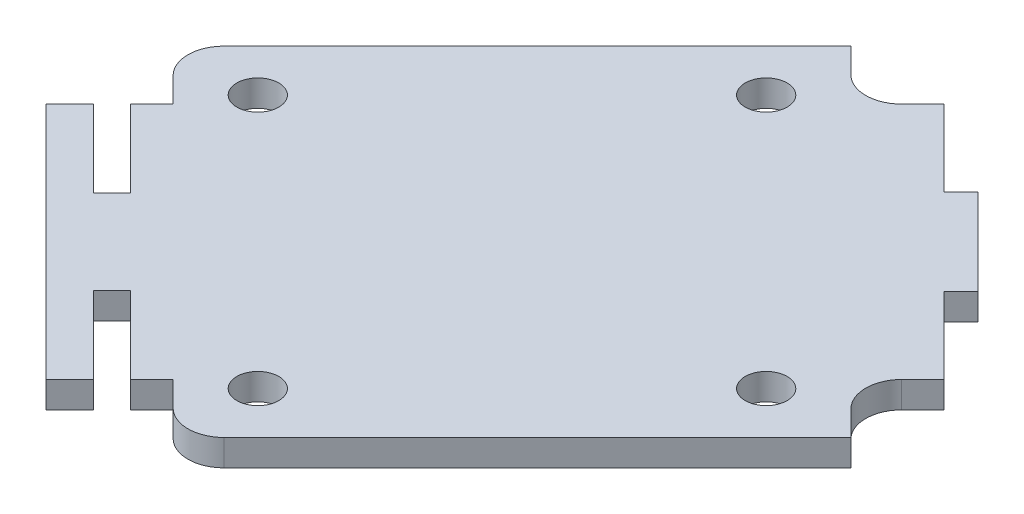
ISO-10303-21;
HEADER;
FILE_DESCRIPTION(('STEP AP214'),'2;1');
FILE_NAME('part.step','',(''),(''),'','','');
FILE_SCHEMA(('AUTOMOTIVE_DESIGN { 1 0 10303 214 1 1 1 1 }'));
ENDSEC;
DATA;
#1=APPLICATION_CONTEXT('core data for automotive mechanical design processes');
#2=APPLICATION_PROTOCOL_DEFINITION('international standard','automotive_design',2000,#1);
#3=PRODUCT_CONTEXT('',#1,'mechanical');
#4=PRODUCT('Part','Part','',(#3));
#5=PRODUCT_RELATED_PRODUCT_CATEGORY('part','',(#4));
#6=PRODUCT_DEFINITION_FORMATION('','',#4);
#7=PRODUCT_DEFINITION_CONTEXT('part definition',#1,'design');
#8=PRODUCT_DEFINITION('design','',#6,#7);
#9=PRODUCT_DEFINITION_SHAPE('','',#8);
#10=(LENGTH_UNIT() NAMED_UNIT(*) SI_UNIT(.MILLI.,.METRE.));
#11=(NAMED_UNIT(*) PLANE_ANGLE_UNIT() SI_UNIT($,.RADIAN.));
#12=(NAMED_UNIT(*) SI_UNIT($,.STERADIAN.) SOLID_ANGLE_UNIT());
#13=UNCERTAINTY_MEASURE_WITH_UNIT(LENGTH_MEASURE(1.E-05),#10,'distance_accuracy_value','');
#14=(GEOMETRIC_REPRESENTATION_CONTEXT(3) GLOBAL_UNCERTAINTY_ASSIGNED_CONTEXT((#13)) GLOBAL_UNIT_ASSIGNED_CONTEXT((#10,
#11,#12)) REPRESENTATION_CONTEXT('',''));
#15=CARTESIAN_POINT('',(0.,0.,0.));
#16=DIRECTION('',(0.,0.,1.));
#17=DIRECTION('',(1.,0.,0.));
#18=AXIS2_PLACEMENT_3D('',#15,#16,#17);
#19=CARTESIAN_POINT('',(8.81909346221887,2.2,8.81909346221887));
#20=DIRECTION('',(0.707106781186548,0.,0.707106781186548));
#21=DIRECTION('',(0.707106781186548,0.,-0.707106781186548));
#22=AXIS2_PLACEMENT_3D('',#19,#20,#21);
#23=PLANE('',#22);
#24=DIRECTION('',(-0.707106781186548,0.,0.707106781186548));
#25=VECTOR('',#24,1.);
#26=CARTESIAN_POINT('',(8.81909346221887,0.,8.81909346221887));
#27=LINE('',#26,#25);
#28=CARTESIAN_POINT('',(-32.4524908137447,0.,50.0906777381824));
#29=VERTEX_POINT('',#28);
#30=CARTESIAN_POINT('',(-58.615441717647,0.,76.2536286420847));
#31=VERTEX_POINT('',#30);
#32=EDGE_CURVE('E267',#29,#31,#27,.T.);
#33=ORIENTED_EDGE('',*,*,#32,.T.);
#34=DIRECTION('',(0.,-1.,0.));
#35=VECTOR('',#34,1.);
#36=CARTESIAN_POINT('',(-58.615441717647,2.2,76.2536286420847));
#37=LINE('',#36,#35);
#38=CARTESIAN_POINT('',(-58.615441717647,2.2,76.2536286420847));
#39=VERTEX_POINT('',#38);
#40=EDGE_CURVE('E11',#39,#31,#37,.T.);
#41=ORIENTED_EDGE('',*,*,#40,.F.);
#42=DIRECTION('',(-0.707106781186548,0.,0.707106781186548));
#43=VECTOR('',#42,1.);
#44=CARTESIAN_POINT('',(8.81909346221887,2.2,8.81909346221887));
#45=LINE('',#44,#43);
#46=CARTESIAN_POINT('',(-32.4524908137447,2.2,50.0906777381824));
#47=VERTEX_POINT('',#46);
#48=EDGE_CURVE('E868',#47,#39,#45,.T.);
#49=ORIENTED_EDGE('',*,*,#48,.F.);
#50=DIRECTION('',(0.,-1.,0.));
#51=VECTOR('',#50,1.);
#52=CARTESIAN_POINT('',(-32.4524908137447,2.2,50.0906777381824));
#53=LINE('',#52,#51);
#54=EDGE_CURVE('E54',#47,#29,#53,.T.);
#55=ORIENTED_EDGE('',*,*,#54,.T.);
#56=EDGE_LOOP('',(#33,#41,#49,#55));
#57=FACE_BOUND('',#56,.T.);
#58=ADVANCED_FACE('F37',(#57),#23,.F.);
#59=CARTESIAN_POINT('',(-56.4941213740873,2.2,78.3749489856443));
#60=DIRECTION('',(0.,-1.,0.));
#61=DIRECTION('',(0.,0.,-1.));
#62=AXIS2_PLACEMENT_3D('',#59,#60,#61);
#63=CYLINDRICAL_SURFACE('',#62,2.99999999999997);
#64=CARTESIAN_POINT('',(-56.4941213740873,0.,78.3749489856443));
#65=DIRECTION('',(0.,1.,0.));
#66=DIRECTION('',(0.,0.,1.));
#67=AXIS2_PLACEMENT_3D('',#64,#65,#66);
#68=CIRCLE('',#67,2.99999999999997);
#69=CARTESIAN_POINT('',(-58.6154417176469,0.,80.4962693292039));
#70=VERTEX_POINT('',#69);
#71=EDGE_CURVE('E269',#31,#70,#68,.T.);
#72=ORIENTED_EDGE('',*,*,#71,.T.);
#73=DIRECTION('',(0.,-1.,0.));
#74=VECTOR('',#73,1.);
#75=CARTESIAN_POINT('',(-58.6154417176469,2.2,80.4962693292039));
#76=LINE('',#75,#74);
#77=CARTESIAN_POINT('',(-58.6154417176469,2.2,80.4962693292039));
#78=VERTEX_POINT('',#77);
#79=EDGE_CURVE('E46',#78,#70,#76,.T.);
#80=ORIENTED_EDGE('',*,*,#79,.F.);
#81=CARTESIAN_POINT('',(-56.4941213740873,2.2,78.3749489856443));
#82=DIRECTION('',(0.,1.,0.));
#83=DIRECTION('',(0.,0.,1.));
#84=AXIS2_PLACEMENT_3D('',#81,#82,#83);
#85=CIRCLE('',#84,2.99999999999997);
#86=EDGE_CURVE('E152',#39,#78,#85,.T.);
#87=ORIENTED_EDGE('',*,*,#86,.F.);
#88=ORIENTED_EDGE('',*,*,#40,.T.);
#89=EDGE_LOOP('',(#72,#80,#87,#88));
#90=FACE_BOUND('',#89,.T.);
#91=ADVANCED_FACE('F486',(#90),#63,.T.);
#92=CARTESIAN_POINT('',(-69.5558555234255,2.2,69.5558555234253));
#93=DIRECTION('',(0.707106781186549,0.,-0.707106781186546));
#94=DIRECTION('',(-0.707106781186546,0.,-0.707106781186549));
#95=AXIS2_PLACEMENT_3D('',#92,#93,#94);
#96=PLANE('',#95);
#97=DIRECTION('',(0.707106781186546,0.,0.707106781186549));
#98=VECTOR('',#97,1.);
#99=CARTESIAN_POINT('',(-69.5558555234255,0.,69.5558555234253));
#100=LINE('',#99,#98);
#101=CARTESIAN_POINT('',(-56.5460185327654,0.,82.5656925140855));
#102=VERTEX_POINT('',#101);
#103=EDGE_CURVE('E271',#70,#102,#100,.T.);
#104=ORIENTED_EDGE('',*,*,#103,.T.);
#105=DIRECTION('',(0.,-1.,0.));
#106=VECTOR('',#105,1.);
#107=CARTESIAN_POINT('',(-56.5460185327654,2.2,82.5656925140855));
#108=LINE('',#107,#106);
#109=CARTESIAN_POINT('',(-56.5460185327654,2.2,82.5656925140855));
#110=VERTEX_POINT('',#109);
#111=EDGE_CURVE('E390',#110,#102,#108,.T.);
#112=ORIENTED_EDGE('',*,*,#111,.F.);
#113=DIRECTION('',(0.707106781186546,0.,0.707106781186549));
#114=VECTOR('',#113,1.);
#115=CARTESIAN_POINT('',(-69.5558555234255,2.2,69.5558555234253));
#116=LINE('',#115,#114);
#117=EDGE_CURVE('E398',#78,#110,#116,.T.);
#118=ORIENTED_EDGE('',*,*,#117,.F.);
#119=ORIENTED_EDGE('',*,*,#79,.T.);
#120=EDGE_LOOP('',(#104,#112,#118,#119));
#121=FACE_BOUND('',#120,.T.);
#122=ADVANCED_FACE('F396',(#121),#96,.F.);
#123=CARTESIAN_POINT('',(13.00983699066,2.2,13.00983699066));
#124=DIRECTION('',(0.707106781186548,0.,0.707106781186548));
#125=DIRECTION('',(0.707106781186548,0.,-0.707106781186548));
#126=AXIS2_PLACEMENT_3D('',#123,#124,#125);
#127=PLANE('',#126);
#128=DIRECTION('',(-0.707106781186548,0.,0.707106781186548));
#129=VECTOR('',#128,1.);
#130=CARTESIAN_POINT('',(13.00983699066,0.,13.00983699066));
#131=LINE('',#130,#129);
#132=CARTESIAN_POINT('',(-58.3137854857318,0.,84.3334594670519));
#133=VERTEX_POINT('',#132);
#134=EDGE_CURVE('E273',#102,#133,#131,.T.);
#135=ORIENTED_EDGE('',*,*,#134,.T.);
#136=DIRECTION('',(0.,-1.,0.));
#137=VECTOR('',#136,1.);
#138=CARTESIAN_POINT('',(-58.3137854857318,2.2,84.3334594670519));
#139=LINE('',#138,#137);
#140=CARTESIAN_POINT('',(-58.3137854857318,2.2,84.3334594670519));
#141=VERTEX_POINT('',#140);
#142=EDGE_CURVE('E388',#141,#133,#139,.T.);
#143=ORIENTED_EDGE('',*,*,#142,.F.);
#144=DIRECTION('',(-0.707106781186548,0.,0.707106781186548));
#145=VECTOR('',#144,1.);
#146=CARTESIAN_POINT('',(13.00983699066,2.2,13.00983699066));
#147=LINE('',#146,#145);
#148=EDGE_CURVE('E409',#110,#141,#147,.T.);
#149=ORIENTED_EDGE('',*,*,#148,.F.);
#150=ORIENTED_EDGE('',*,*,#111,.T.);
#151=EDGE_LOOP('',(#135,#143,#149,#150));
#152=FACE_BOUND('',#151,.T.);
#153=ADVANCED_FACE('F406',(#152),#127,.F.);
#154=CARTESIAN_POINT('',(-71.3236224763918,2.2,71.3236224763918));
#155=DIRECTION('',(-0.707106781186548,0.,0.707106781186548));
#156=DIRECTION('',(0.707106781186548,0.,0.707106781186548));
#157=AXIS2_PLACEMENT_3D('',#154,#155,#156);
#158=PLANE('',#157);
#159=DIRECTION('',(-0.707106781186548,0.,-0.707106781186548));
#160=VECTOR('',#159,1.);
#161=CARTESIAN_POINT('',(-71.3236224763918,0.,71.3236224763918));
#162=LINE('',#161,#160);
#163=CARTESIAN_POINT('',(-51.8979272963749,0.,90.7493176564088));
#164=VERTEX_POINT('',#163);
#165=EDGE_CURVE('E276',#164,#133,#162,.T.);
#166=ORIENTED_EDGE('',*,*,#165,.F.);
#167=DIRECTION('',(0.,-1.,0.));
#168=VECTOR('',#167,1.);
#169=CARTESIAN_POINT('',(-51.8979272963749,2.2,90.7493176564088));
#170=LINE('',#169,#168);
#171=CARTESIAN_POINT('',(-51.8979272963749,2.2,90.7493176564088));
#172=VERTEX_POINT('',#171);
#173=EDGE_CURVE('E386',#172,#164,#170,.T.);
#174=ORIENTED_EDGE('',*,*,#173,.F.);
#175=DIRECTION('',(-0.707106781186548,0.,-0.707106781186548));
#176=VECTOR('',#175,1.);
#177=CARTESIAN_POINT('',(-71.3236224763918,2.2,71.3236224763918));
#178=LINE('',#177,#176);
#179=EDGE_CURVE('E411',#172,#141,#178,.T.);
#180=ORIENTED_EDGE('',*,*,#179,.T.);
#181=ORIENTED_EDGE('',*,*,#142,.T.);
#182=EDGE_LOOP('',(#166,#174,#180,#181));
#183=FACE_BOUND('',#182,.T.);
#184=ADVANCED_FACE('F765',(#183),#158,.T.);
#185=CARTESIAN_POINT('',(19.4256951800169,2.2,19.4256951800169));
#186=DIRECTION('',(0.707106781186548,0.,0.707106781186548));
#187=DIRECTION('',(0.707106781186548,0.,-0.707106781186548));
#188=AXIS2_PLACEMENT_3D('',#185,#186,#187);
#189=PLANE('',#188);
#190=DIRECTION('',(-0.707106781186548,0.,0.707106781186548));
#191=VECTOR('',#190,1.);
#192=CARTESIAN_POINT('',(19.4256951800169,0.,19.4256951800169));
#193=LINE('',#192,#191);
#194=CARTESIAN_POINT('',(-53.453562214986,0.,92.3049525750199));
#195=VERTEX_POINT('',#194);
#196=EDGE_CURVE('E279',#164,#195,#193,.T.);
#197=ORIENTED_EDGE('',*,*,#196,.T.);
#198=DIRECTION('',(0.,-1.,0.));
#199=VECTOR('',#198,1.);
#200=CARTESIAN_POINT('',(-53.453562214986,2.2,92.3049525750199));
#201=LINE('',#200,#199);
#202=CARTESIAN_POINT('',(-53.453562214986,2.2,92.3049525750199));
#203=VERTEX_POINT('',#202);
#204=EDGE_CURVE('E383',#203,#195,#201,.T.);
#205=ORIENTED_EDGE('',*,*,#204,.F.);
#206=DIRECTION('',(-0.707106781186548,0.,0.707106781186548));
#207=VECTOR('',#206,1.);
#208=CARTESIAN_POINT('',(19.4256951800169,2.2,19.4256951800169));
#209=LINE('',#208,#207);
#210=EDGE_CURVE('E413',#172,#203,#209,.T.);
#211=ORIENTED_EDGE('',*,*,#210,.F.);
#212=ORIENTED_EDGE('',*,*,#173,.T.);
#213=EDGE_LOOP('',(#197,#205,#211,#212));
#214=FACE_BOUND('',#213,.T.);
#215=ADVANCED_FACE('F755',(#214),#189,.F.);
#216=CARTESIAN_POINT('',(-72.8792573950032,2.2,72.8792573950026));
#217=DIRECTION('',(-0.707106781186551,0.,0.707106781186544));
#218=DIRECTION('',(0.707106781186544,0.,0.707106781186551));
#219=AXIS2_PLACEMENT_3D('',#216,#217,#218);
#220=PLANE('',#219);
#221=DIRECTION('',(-0.707106781186544,0.,-0.707106781186551));
#222=VECTOR('',#221,1.);
#223=CARTESIAN_POINT('',(-72.8792573950032,0.,72.8792573950026));
#224=LINE('',#223,#222);
#225=CARTESIAN_POINT('',(-59.8694204043542,0.,85.8890943856517));
#226=VERTEX_POINT('',#225);
#227=EDGE_CURVE('E281',#195,#226,#224,.T.);
#228=ORIENTED_EDGE('',*,*,#227,.T.);
#229=DIRECTION('',(0.,-1.,0.));
#230=VECTOR('',#229,1.);
#231=CARTESIAN_POINT('',(-59.8694204043542,2.2,85.8890943856517));
#232=LINE('',#231,#230);
#233=CARTESIAN_POINT('',(-59.8694204043542,2.2,85.8890943856517));
#234=VERTEX_POINT('',#233);
#235=EDGE_CURVE('E380',#234,#226,#232,.T.);
#236=ORIENTED_EDGE('',*,*,#235,.F.);
#237=DIRECTION('',(-0.707106781186544,0.,-0.707106781186551));
#238=VECTOR('',#237,1.);
#239=CARTESIAN_POINT('',(-72.8792573950032,2.2,72.8792573950026));
#240=LINE('',#239,#238);
#241=EDGE_CURVE('E419',#203,#234,#240,.T.);
#242=ORIENTED_EDGE('',*,*,#241,.F.);
#243=ORIENTED_EDGE('',*,*,#204,.T.);
#244=EDGE_LOOP('',(#228,#236,#242,#243));
#245=FACE_BOUND('',#244,.T.);
#246=ADVANCED_FACE('F745',(#245),#220,.F.);
#247=CARTESIAN_POINT('',(13.0098369906487,2.2,13.0098369906487));
#248=DIRECTION('',(0.707106781186548,0.,0.707106781186548));
#249=DIRECTION('',(0.707106781186548,0.,-0.707106781186548));
#250=AXIS2_PLACEMENT_3D('',#247,#248,#249);
#251=PLANE('',#250);
#252=DIRECTION('',(-0.707106781186548,0.,0.707106781186548));
#253=VECTOR('',#252,1.);
#254=CARTESIAN_POINT('',(13.0098369906487,0.,13.0098369906487));
#255=LINE('',#254,#253);
#256=CARTESIAN_POINT('',(-61.8493193916766,0.,87.8689933729741));
#257=VERTEX_POINT('',#256);
#258=EDGE_CURVE('E283',#226,#257,#255,.T.);
#259=ORIENTED_EDGE('',*,*,#258,.T.);
#260=DIRECTION('',(0.,-1.,0.));
#261=VECTOR('',#260,1.);
#262=CARTESIAN_POINT('',(-61.8493193916766,2.2,87.8689933729741));
#263=LINE('',#262,#261);
#264=CARTESIAN_POINT('',(-61.8493193916766,2.2,87.8689933729741));
#265=VERTEX_POINT('',#264);
#266=EDGE_CURVE('E378',#265,#257,#263,.T.);
#267=ORIENTED_EDGE('',*,*,#266,.F.);
#268=DIRECTION('',(-0.707106781186548,0.,0.707106781186548));
#269=VECTOR('',#268,1.);
#270=CARTESIAN_POINT('',(13.0098369906487,2.2,13.0098369906487));
#271=LINE('',#270,#269);
#272=EDGE_CURVE('E421',#234,#265,#271,.T.);
#273=ORIENTED_EDGE('',*,*,#272,.F.);
#274=ORIENTED_EDGE('',*,*,#235,.T.);
#275=EDGE_LOOP('',(#259,#267,#273,#274));
#276=FACE_BOUND('',#275,.T.);
#277=ADVANCED_FACE('F734',(#276),#251,.F.);
#278=CARTESIAN_POINT('',(-74.8591563823255,2.2,74.8591563823252));
#279=DIRECTION('',(-0.707106781186549,0.,0.707106781186547));
#280=DIRECTION('',(0.707106781186547,0.,0.707106781186549));
#281=AXIS2_PLACEMENT_3D('',#278,#279,#280);
#282=PLANE('',#281);
#283=DIRECTION('',(-0.707106781186547,0.,-0.707106781186549));
#284=VECTOR('',#283,1.);
#285=CARTESIAN_POINT('',(-74.8591563823255,0.,74.8591563823252));
#286=LINE('',#285,#284);
#287=CARTESIAN_POINT('',(-41.9465352010801,0.,107.771777563571));
#288=VERTEX_POINT('',#287);
#289=EDGE_CURVE('E286',#288,#257,#286,.T.);
#290=ORIENTED_EDGE('',*,*,#289,.F.);
#291=DIRECTION('',(0.,-1.,0.));
#292=VECTOR('',#291,1.);
#293=CARTESIAN_POINT('',(-41.9465352010801,2.2,107.771777563571));
#294=LINE('',#293,#292);
#295=CARTESIAN_POINT('',(-41.9465352010801,2.2,107.771777563571));
#296=VERTEX_POINT('',#295);
#297=EDGE_CURVE('E376',#296,#288,#294,.T.);
#298=ORIENTED_EDGE('',*,*,#297,.F.);
#299=DIRECTION('',(-0.707106781186547,0.,-0.707106781186549));
#300=VECTOR('',#299,1.);
#301=CARTESIAN_POINT('',(-74.8591563823255,2.2,74.8591563823252));
#302=LINE('',#301,#300);
#303=EDGE_CURVE('E423',#296,#265,#302,.T.);
#304=ORIENTED_EDGE('',*,*,#303,.T.);
#305=ORIENTED_EDGE('',*,*,#266,.T.);
#306=EDGE_LOOP('',(#290,#298,#304,#305));
#307=FACE_BOUND('',#306,.T.);
#308=ADVANCED_FACE('F724',(#307),#282,.T.);
#309=CARTESIAN_POINT('',(32.9126211812447,2.2,32.9126211812438));
#310=DIRECTION('',(0.707106781186557,0.,0.707106781186538));
#311=DIRECTION('',(0.707106781186538,0.,-0.707106781186557));
#312=AXIS2_PLACEMENT_3D('',#309,#310,#311);
#313=PLANE('',#312);
#314=DIRECTION('',(-0.707106781186538,0.,0.707106781186557));
#315=VECTOR('',#314,1.);
#316=CARTESIAN_POINT('',(32.9126211812447,0.,32.9126211812438));
#317=LINE('',#316,#315);
#318=CARTESIAN_POINT('',(-39.9666362137577,0.,105.791878576248));
#319=VERTEX_POINT('',#318);
#320=EDGE_CURVE('E289',#319,#288,#317,.T.);
#321=ORIENTED_EDGE('',*,*,#320,.F.);
#322=DIRECTION('',(0.,-1.,0.));
#323=VECTOR('',#322,1.);
#324=CARTESIAN_POINT('',(-39.9666362137577,2.2,105.791878576248));
#325=LINE('',#324,#323);
#326=CARTESIAN_POINT('',(-39.9666362137577,2.2,105.791878576248));
#327=VERTEX_POINT('',#326);
#328=EDGE_CURVE('E374',#327,#319,#325,.T.);
#329=ORIENTED_EDGE('',*,*,#328,.F.);
#330=DIRECTION('',(-0.707106781186538,0.,0.707106781186557));
#331=VECTOR('',#330,1.);
#332=CARTESIAN_POINT('',(32.9126211812447,2.2,32.9126211812438));
#333=LINE('',#332,#331);
#334=EDGE_CURVE('E426',#327,#296,#333,.T.);
#335=ORIENTED_EDGE('',*,*,#334,.T.);
#336=ORIENTED_EDGE('',*,*,#297,.T.);
#337=EDGE_LOOP('',(#321,#329,#335,#336));
#338=FACE_BOUND('',#337,.T.);
#339=ADVANCED_FACE('F714',(#338),#313,.T.);
#340=CARTESIAN_POINT('',(-72.8792573950021,2.2,72.8792573950052));
#341=DIRECTION('',(-0.707106781186532,0.,0.707106781186563));
#342=DIRECTION('',(0.707106781186563,0.,0.707106781186532));
#343=AXIS2_PLACEMENT_3D('',#340,#341,#342);
#344=PLANE('',#343);
#345=DIRECTION('',(-0.707106781186563,0.,-0.707106781186532));
#346=VECTOR('',#345,1.);
#347=CARTESIAN_POINT('',(-72.8792573950021,0.,72.8792573950052));
#348=LINE('',#347,#346);
#349=CARTESIAN_POINT('',(-46.3824944031206,0.,99.3760203868855));
#350=VERTEX_POINT('',#349);
#351=EDGE_CURVE('E292',#319,#350,#348,.T.);
#352=ORIENTED_EDGE('',*,*,#351,.T.);
#353=DIRECTION('',(0.,-1.,0.));
#354=VECTOR('',#353,1.);
#355=CARTESIAN_POINT('',(-46.3824944031206,2.2,99.3760203868855));
#356=LINE('',#355,#354);
#357=CARTESIAN_POINT('',(-46.3824944031206,2.2,99.3760203868855));
#358=VERTEX_POINT('',#357);
#359=EDGE_CURVE('E372',#358,#350,#356,.T.);
#360=ORIENTED_EDGE('',*,*,#359,.F.);
#361=DIRECTION('',(-0.707106781186563,0.,-0.707106781186532));
#362=VECTOR('',#361,1.);
#363=CARTESIAN_POINT('',(-72.8792573950021,2.2,72.8792573950052));
#364=LINE('',#363,#362);
#365=EDGE_CURVE('E429',#327,#358,#364,.T.);
#366=ORIENTED_EDGE('',*,*,#365,.F.);
#367=ORIENTED_EDGE('',*,*,#328,.T.);
#368=EDGE_LOOP('',(#352,#360,#366,#367));
#369=FACE_BOUND('',#368,.T.);
#370=ADVANCED_FACE('F704',(#369),#344,.F.);
#371=CARTESIAN_POINT('',(26.4967629918824,2.2,26.4967629918824));
#372=DIRECTION('',(0.707106781186548,0.,0.707106781186548));
#373=DIRECTION('',(0.707106781186548,0.,-0.707106781186548));
#374=AXIS2_PLACEMENT_3D('',#371,#372,#373);
#375=PLANE('',#374);
#376=DIRECTION('',(-0.707106781186548,0.,0.707106781186548));
#377=VECTOR('',#376,1.);
#378=CARTESIAN_POINT('',(26.4967629918824,0.,26.4967629918824));
#379=LINE('',#378,#377);
#380=CARTESIAN_POINT('',(-44.8268594845094,0.,97.8203854682743));
#381=VERTEX_POINT('',#380);
#382=EDGE_CURVE('E295',#381,#350,#379,.T.);
#383=ORIENTED_EDGE('',*,*,#382,.F.);
#384=DIRECTION('',(0.,-1.,0.));
#385=VECTOR('',#384,1.);
#386=CARTESIAN_POINT('',(-44.8268594845094,2.2,97.8203854682743));
#387=LINE('',#386,#385);
#388=CARTESIAN_POINT('',(-44.8268594845094,2.2,97.8203854682743));
#389=VERTEX_POINT('',#388);
#390=EDGE_CURVE('E370',#389,#381,#387,.T.);
#391=ORIENTED_EDGE('',*,*,#390,.F.);
#392=DIRECTION('',(-0.707106781186548,0.,0.707106781186548));
#393=VECTOR('',#392,1.);
#394=CARTESIAN_POINT('',(26.4967629918824,2.2,26.4967629918824));
#395=LINE('',#394,#393);
#396=EDGE_CURVE('E431',#389,#358,#395,.T.);
#397=ORIENTED_EDGE('',*,*,#396,.T.);
#398=ORIENTED_EDGE('',*,*,#359,.T.);
#399=EDGE_LOOP('',(#383,#391,#397,#398));
#400=FACE_BOUND('',#399,.T.);
#401=ADVANCED_FACE('F694',(#400),#375,.T.);
#402=CARTESIAN_POINT('',(-71.3236224763918,2.2,71.3236224763918));
#403=DIRECTION('',(-0.707106781186548,0.,0.707106781186548));
#404=DIRECTION('',(0.707106781186548,0.,0.707106781186548));
#405=AXIS2_PLACEMENT_3D('',#402,#403,#404);
#406=PLANE('',#405);
#407=DIRECTION('',(-0.707106781186548,0.,-0.707106781186548));
#408=VECTOR('',#407,1.);
#409=CARTESIAN_POINT('',(-71.3236224763918,0.,71.3236224763918));
#410=LINE('',#409,#408);
#411=CARTESIAN_POINT('',(-38.4110012951522,0.,104.236243657632));
#412=VERTEX_POINT('',#411);
#413=EDGE_CURVE('E298',#412,#381,#410,.T.);
#414=ORIENTED_EDGE('',*,*,#413,.F.);
#415=DIRECTION('',(0.,-1.,0.));
#416=VECTOR('',#415,1.);
#417=CARTESIAN_POINT('',(-38.4110012951522,2.2,104.236243657632));
#418=LINE('',#417,#416);
#419=CARTESIAN_POINT('',(-38.4110012951522,2.2,104.236243657632));
#420=VERTEX_POINT('',#419);
#421=EDGE_CURVE('E368',#420,#412,#418,.T.);
#422=ORIENTED_EDGE('',*,*,#421,.F.);
#423=DIRECTION('',(-0.707106781186548,0.,-0.707106781186548));
#424=VECTOR('',#423,1.);
#425=CARTESIAN_POINT('',(-71.3236224763918,2.2,71.3236224763918));
#426=LINE('',#425,#424);
#427=EDGE_CURVE('E434',#420,#389,#426,.T.);
#428=ORIENTED_EDGE('',*,*,#427,.T.);
#429=ORIENTED_EDGE('',*,*,#390,.T.);
#430=EDGE_LOOP('',(#414,#422,#428,#429));
#431=FACE_BOUND('',#430,.T.);
#432=ADVANCED_FACE('F684',(#431),#406,.T.);
#433=CARTESIAN_POINT('',(32.9126211812397,2.2,32.9126211812397));
#434=DIRECTION('',(0.707106781186548,0.,0.707106781186548));
#435=DIRECTION('',(0.707106781186548,0.,-0.707106781186548));
#436=AXIS2_PLACEMENT_3D('',#433,#434,#435);
#437=PLANE('',#436);
#438=DIRECTION('',(-0.707106781186548,0.,0.707106781186548));
#439=VECTOR('',#438,1.);
#440=CARTESIAN_POINT('',(32.9126211812397,0.,32.9126211812397));
#441=LINE('',#440,#439);
#442=CARTESIAN_POINT('',(-36.6432343421857,0.,102.468476704665));
#443=VERTEX_POINT('',#442);
#444=EDGE_CURVE('E301',#443,#412,#441,.T.);
#445=ORIENTED_EDGE('',*,*,#444,.F.);
#446=DIRECTION('',(0.,-1.,0.));
#447=VECTOR('',#446,1.);
#448=CARTESIAN_POINT('',(-36.6432343421857,2.2,102.468476704665));
#449=LINE('',#448,#447);
#450=CARTESIAN_POINT('',(-36.6432343421857,2.2,102.468476704665));
#451=VERTEX_POINT('',#450);
#452=EDGE_CURVE('E366',#451,#443,#449,.T.);
#453=ORIENTED_EDGE('',*,*,#452,.F.);
#454=DIRECTION('',(-0.707106781186548,0.,0.707106781186548));
#455=VECTOR('',#454,1.);
#456=CARTESIAN_POINT('',(32.9126211812397,2.2,32.9126211812397));
#457=LINE('',#456,#455);
#458=EDGE_CURVE('E437',#451,#420,#457,.T.);
#459=ORIENTED_EDGE('',*,*,#458,.T.);
#460=ORIENTED_EDGE('',*,*,#421,.T.);
#461=EDGE_LOOP('',(#445,#453,#459,#460));
#462=FACE_BOUND('',#461,.T.);
#463=ADVANCED_FACE('F674',(#462),#437,.T.);
#464=CARTESIAN_POINT('',(-69.5558555234254,2.2,69.5558555234256));
#465=DIRECTION('',(0.707106781186546,0.,-0.707106781186549));
#466=DIRECTION('',(-0.707106781186549,0.,-0.707106781186546));
#467=AXIS2_PLACEMENT_3D('',#464,#465,#466);
#468=PLANE('',#467);
#469=DIRECTION('',(0.707106781186549,0.,0.707106781186546));
#470=VECTOR('',#469,1.);
#471=CARTESIAN_POINT('',(-69.5558555234254,0.,69.5558555234256));
#472=LINE('',#471,#470);
#473=CARTESIAN_POINT('',(-34.5738111573043,0.,104.537899889547));
#474=VERTEX_POINT('',#473);
#475=EDGE_CURVE('E304',#443,#474,#472,.T.);
#476=ORIENTED_EDGE('',*,*,#475,.T.);
#477=DIRECTION('',(0.,-1.,0.));
#478=VECTOR('',#477,1.);
#479=CARTESIAN_POINT('',(-34.5738111573043,2.2,104.537899889547));
#480=LINE('',#479,#478);
#481=CARTESIAN_POINT('',(-34.5738111573043,2.2,104.537899889547));
#482=VERTEX_POINT('',#481);
#483=EDGE_CURVE('E363',#482,#474,#480,.T.);
#484=ORIENTED_EDGE('',*,*,#483,.F.);
#485=DIRECTION('',(0.707106781186549,0.,0.707106781186546));
#486=VECTOR('',#485,1.);
#487=CARTESIAN_POINT('',(-69.5558555234254,2.2,69.5558555234256));
#488=LINE('',#487,#486);
#489=EDGE_CURVE('E440',#451,#482,#488,.T.);
#490=ORIENTED_EDGE('',*,*,#489,.F.);
#491=ORIENTED_EDGE('',*,*,#452,.T.);
#492=EDGE_LOOP('',(#476,#484,#490,#491));
#493=FACE_BOUND('',#492,.T.);
#494=ADVANCED_FACE('F664',(#493),#468,.F.);
#495=CARTESIAN_POINT('',(-32.4524908137447,2.2,102.416579545987));
#496=DIRECTION('',(0.,-1.,0.));
#497=DIRECTION('',(0.,0.,-1.));
#498=AXIS2_PLACEMENT_3D('',#495,#496,#497);
#499=CYLINDRICAL_SURFACE('',#498,2.99999999999996);
#500=CARTESIAN_POINT('',(-32.4524908137447,0.,102.416579545987));
#501=DIRECTION('',(0.,1.,0.));
#502=DIRECTION('',(0.,0.,1.));
#503=AXIS2_PLACEMENT_3D('',#500,#501,#502);
#504=CIRCLE('',#503,2.99999999999996);
#505=CARTESIAN_POINT('',(-30.3311704701851,0.,104.537899889547));
#506=VERTEX_POINT('',#505);
#507=EDGE_CURVE('E306',#474,#506,#504,.T.);
#508=ORIENTED_EDGE('',*,*,#507,.T.);
#509=DIRECTION('',(0.,-1.,0.));
#510=VECTOR('',#509,1.);
#511=CARTESIAN_POINT('',(-30.3311704701851,2.2,104.537899889547));
#512=LINE('',#511,#510);
#513=CARTESIAN_POINT('',(-30.3311704701851,2.2,104.537899889547));
#514=VERTEX_POINT('',#513);
#515=EDGE_CURVE('E361',#514,#506,#512,.T.);
#516=ORIENTED_EDGE('',*,*,#515,.F.);
#517=CARTESIAN_POINT('',(-32.4524908137447,2.2,102.416579545987));
#518=DIRECTION('',(0.,1.,0.));
#519=DIRECTION('',(0.,0.,1.));
#520=AXIS2_PLACEMENT_3D('',#517,#518,#519);
#521=CIRCLE('',#520,2.99999999999996);
#522=EDGE_CURVE('E442',#482,#514,#521,.T.);
#523=ORIENTED_EDGE('',*,*,#522,.F.);
#524=ORIENTED_EDGE('',*,*,#483,.T.);
#525=EDGE_LOOP('',(#508,#516,#523,#524));
#526=FACE_BOUND('',#525,.T.);
#527=ADVANCED_FACE('F654',(#526),#499,.T.);
#528=CARTESIAN_POINT('',(37.1033647096807,2.2,37.1033647096807));
#529=DIRECTION('',(0.707106781186547,0.,0.707106781186548));
#530=DIRECTION('',(0.707106781186548,0.,-0.707106781186547));
#531=AXIS2_PLACEMENT_3D('',#528,#529,#530);
#532=PLANE('',#531);
#533=DIRECTION('',(-0.707106781186548,0.,0.707106781186547));
#534=VECTOR('',#533,1.);
#535=CARTESIAN_POINT('',(37.1033647096807,0.,37.1033647096807));
#536=LINE('',#535,#534);
#537=CARTESIAN_POINT('',(-4.1682195662828,0.,78.3749489856442));
#538=VERTEX_POINT('',#537);
#539=EDGE_CURVE('E309',#538,#506,#536,.T.);
#540=ORIENTED_EDGE('',*,*,#539,.F.);
#541=DIRECTION('',(0.,-1.,0.));
#542=VECTOR('',#541,1.);
#543=CARTESIAN_POINT('',(-4.1682195662828,2.2,78.3749489856442));
#544=LINE('',#543,#542);
#545=CARTESIAN_POINT('',(-4.1682195662828,2.2,78.3749489856442));
#546=VERTEX_POINT('',#545);
#547=EDGE_CURVE('E359',#546,#538,#544,.T.);
#548=ORIENTED_EDGE('',*,*,#547,.F.);
#549=DIRECTION('',(-0.707106781186548,0.,0.707106781186547));
#550=VECTOR('',#549,1.);
#551=CARTESIAN_POINT('',(37.1033647096807,2.2,37.1033647096807));
#552=LINE('',#551,#550);
#553=EDGE_CURVE('E444',#546,#514,#552,.T.);
#554=ORIENTED_EDGE('',*,*,#553,.T.);
#555=ORIENTED_EDGE('',*,*,#515,.T.);
#556=EDGE_LOOP('',(#540,#548,#554,#555));
#557=FACE_BOUND('',#556,.T.);
#558=ADVANCED_FACE('F644',(#557),#532,.T.);
#559=CARTESIAN_POINT('',(-41.2715842759635,2.2,41.2715842759635));
#560=DIRECTION('',(0.707106781186548,0.,-0.707106781186547));
#561=DIRECTION('',(-0.707106781186547,0.,-0.707106781186548));
#562=AXIS2_PLACEMENT_3D('',#559,#560,#561);
#563=PLANE('',#562);
#564=DIRECTION('',(0.707106781186547,0.,0.707106781186548));
#565=VECTOR('',#564,1.);
#566=CARTESIAN_POINT('',(-41.2715842759635,0.,41.2715842759635));
#567=LINE('',#566,#565);
#568=CARTESIAN_POINT('',(-6.23764275116422,0.,76.3055258007628));
#569=VERTEX_POINT('',#568);
#570=EDGE_CURVE('E312',#569,#538,#567,.T.);
#571=ORIENTED_EDGE('',*,*,#570,.F.);
#572=DIRECTION('',(0.,-1.,0.));
#573=VECTOR('',#572,1.);
#574=CARTESIAN_POINT('',(-6.23764275116422,2.2,76.3055258007628));
#575=LINE('',#574,#573);
#576=CARTESIAN_POINT('',(-6.23764275116422,2.2,76.3055258007628));
#577=VERTEX_POINT('',#576);
#578=EDGE_CURVE('E357',#577,#569,#575,.T.);
#579=ORIENTED_EDGE('',*,*,#578,.F.);
#580=DIRECTION('',(0.707106781186547,0.,0.707106781186548));
#581=VECTOR('',#580,1.);
#582=CARTESIAN_POINT('',(-41.2715842759635,2.2,41.2715842759635));
#583=LINE('',#582,#581);
#584=EDGE_CURVE('E447',#577,#546,#583,.T.);
#585=ORIENTED_EDGE('',*,*,#584,.T.);
#586=ORIENTED_EDGE('',*,*,#547,.T.);
#587=EDGE_LOOP('',(#571,#579,#585,#586));
#588=FACE_BOUND('',#587,.T.);
#589=ADVANCED_FACE('F634',(#588),#563,.T.);
#590=CARTESIAN_POINT('',(-4.11632240760461,2.2,74.1842054572032));
#591=DIRECTION('',(0.,-1.,0.));
#592=DIRECTION('',(0.,0.,-1.));
#593=AXIS2_PLACEMENT_3D('',#590,#591,#592);
#594=CYLINDRICAL_SURFACE('',#593,2.99999999999997);
#595=CARTESIAN_POINT('',(-4.11632240760461,0.,74.1842054572032));
#596=DIRECTION('',(0.,1.,0.));
#597=DIRECTION('',(0.,0.,1.));
#598=AXIS2_PLACEMENT_3D('',#595,#596,#597);
#599=CIRCLE('',#598,2.99999999999997);
#600=CARTESIAN_POINT('',(-6.23764275116423,0.,72.0628851136436));
#601=VERTEX_POINT('',#600);
#602=EDGE_CURVE('E315',#569,#601,#599,.F.);
#603=ORIENTED_EDGE('',*,*,#602,.T.);
#604=DIRECTION('',(0.,-1.,0.));
#605=VECTOR('',#604,1.);
#606=CARTESIAN_POINT('',(-6.23764275116423,2.2,72.0628851136436));
#607=LINE('',#606,#605);
#608=CARTESIAN_POINT('',(-6.23764275116423,2.2,72.0628851136436));
#609=VERTEX_POINT('',#608);
#610=EDGE_CURVE('E355',#609,#601,#607,.T.);
#611=ORIENTED_EDGE('',*,*,#610,.F.);
#612=CARTESIAN_POINT('',(-4.11632240760461,2.2,74.1842054572032));
#613=DIRECTION('',(0.,1.,0.));
#614=DIRECTION('',(0.,0.,1.));
#615=AXIS2_PLACEMENT_3D('',#612,#613,#614);
#616=CIRCLE('',#615,2.99999999999997);
#617=EDGE_CURVE('E450',#577,#609,#616,.F.);
#618=ORIENTED_EDGE('',*,*,#617,.F.);
#619=ORIENTED_EDGE('',*,*,#578,.T.);
#620=EDGE_LOOP('',(#603,#611,#618,#619));
#621=FACE_BOUND('',#620,.T.);
#622=ADVANCED_FACE('F624',(#621),#594,.F.);
#623=CARTESIAN_POINT('',(32.9126211812397,2.2,32.9126211812398));
#624=DIRECTION('',(0.707106781186547,0.,0.707106781186548));
#625=DIRECTION('',(0.707106781186548,0.,-0.707106781186547));
#626=AXIS2_PLACEMENT_3D('',#623,#624,#625);
#627=PLANE('',#626);
#628=DIRECTION('',(-0.707106781186548,0.,0.707106781186547));
#629=VECTOR('',#628,1.);
#630=CARTESIAN_POINT('',(32.9126211812397,0.,32.9126211812398));
#631=LINE('',#630,#629);
#632=CARTESIAN_POINT('',(-4.46987579819885,0.,70.2951181606782));
#633=VERTEX_POINT('',#632);
#634=EDGE_CURVE('E318',#633,#601,#631,.T.);
#635=ORIENTED_EDGE('',*,*,#634,.F.);
#636=DIRECTION('',(0.,-1.,0.));
#637=VECTOR('',#636,1.);
#638=CARTESIAN_POINT('',(-4.46987579819885,2.2,70.2951181606782));
#639=LINE('',#638,#637);
#640=CARTESIAN_POINT('',(-4.46987579819885,2.2,70.2951181606782));
#641=VERTEX_POINT('',#640);
#642=EDGE_CURVE('E353',#641,#633,#639,.T.);
#643=ORIENTED_EDGE('',*,*,#642,.F.);
#644=DIRECTION('',(-0.707106781186548,0.,0.707106781186547));
#645=VECTOR('',#644,1.);
#646=CARTESIAN_POINT('',(32.9126211812397,2.2,32.9126211812398));
#647=LINE('',#646,#645);
#648=EDGE_CURVE('E452',#641,#609,#647,.T.);
#649=ORIENTED_EDGE('',*,*,#648,.T.);
#650=ORIENTED_EDGE('',*,*,#610,.T.);
#651=EDGE_LOOP('',(#635,#643,#649,#650));
#652=FACE_BOUND('',#651,.T.);
#653=ADVANCED_FACE('F614',(#652),#627,.T.);
#654=CARTESIAN_POINT('',(-37.3824969794386,2.2,37.3824969794376));
#655=DIRECTION('',(-0.707106781186557,0.,0.707106781186538));
#656=DIRECTION('',(0.707106781186538,0.,0.707106781186557));
#657=AXIS2_PLACEMENT_3D('',#654,#655,#656);
#658=PLANE('',#657);
#659=DIRECTION('',(-0.707106781186538,0.,-0.707106781186557));
#660=VECTOR('',#659,1.);
#661=CARTESIAN_POINT('',(-37.3824969794386,0.,37.3824969794376));
#662=LINE('',#661,#660);
#663=CARTESIAN_POINT('',(-10.8338368288802,0.,63.9311571299967));
#664=VERTEX_POINT('',#663);
#665=EDGE_CURVE('E321',#633,#664,#662,.T.);
#666=ORIENTED_EDGE('',*,*,#665,.T.);
#667=DIRECTION('',(0.,-1.,0.));
#668=VECTOR('',#667,1.);
#669=CARTESIAN_POINT('',(-10.8338368288802,2.2,63.9311571299967));
#670=LINE('',#669,#668);
#671=CARTESIAN_POINT('',(-10.8338368288802,2.2,63.9311571299967));
#672=VERTEX_POINT('',#671);
#673=EDGE_CURVE('E350',#672,#664,#670,.T.);
#674=ORIENTED_EDGE('',*,*,#673,.F.);
#675=DIRECTION('',(-0.707106781186538,0.,-0.707106781186557));
#676=VECTOR('',#675,1.);
#677=CARTESIAN_POINT('',(-37.3824969794386,2.2,37.3824969794376));
#678=LINE('',#677,#676);
#679=EDGE_CURVE('E455',#641,#672,#678,.T.);
#680=ORIENTED_EDGE('',*,*,#679,.F.);
#681=ORIENTED_EDGE('',*,*,#642,.T.);
#682=EDGE_LOOP('',(#666,#674,#680,#681));
#683=FACE_BOUND('',#682,.T.);
#684=ADVANCED_FACE('F604',(#683),#658,.F.);
#685=CARTESIAN_POINT('',(26.5486601505583,2.2,26.5486601505589));
#686=DIRECTION('',(-0.707106781186541,0.,-0.707106781186554));
#687=DIRECTION('',(-0.707106781186554,0.,0.707106781186541));
#688=AXIS2_PLACEMENT_3D('',#685,#686,#687);
#689=PLANE('',#688);
#690=DIRECTION('',(0.707106781186554,0.,-0.707106781186541));
#691=VECTOR('',#690,1.);
#692=CARTESIAN_POINT('',(26.5486601505583,0.,26.5486601505589));
#693=LINE('',#692,#691);
#694=CARTESIAN_POINT('',(-9.41962326650732,0.,62.5169435676238));
#695=VERTEX_POINT('',#694);
#696=EDGE_CURVE('E323',#664,#695,#693,.T.);
#697=ORIENTED_EDGE('',*,*,#696,.T.);
#698=DIRECTION('',(0.,-1.,0.));
#699=VECTOR('',#698,1.);
#700=CARTESIAN_POINT('',(-9.41962326650732,2.2,62.5169435676238));
#701=LINE('',#700,#699);
#702=CARTESIAN_POINT('',(-9.41962326650732,2.2,62.5169435676238));
#703=VERTEX_POINT('',#702);
#704=EDGE_CURVE('E348',#703,#695,#701,.T.);
#705=ORIENTED_EDGE('',*,*,#704,.F.);
#706=DIRECTION('',(0.707106781186554,0.,-0.707106781186541));
#707=VECTOR('',#706,1.);
#708=CARTESIAN_POINT('',(26.5486601505583,2.2,26.5486601505589));
#709=LINE('',#708,#707);
#710=EDGE_CURVE('E457',#672,#703,#709,.T.);
#711=ORIENTED_EDGE('',*,*,#710,.F.);
#712=ORIENTED_EDGE('',*,*,#673,.T.);
#713=EDGE_LOOP('',(#697,#705,#711,#712));
#714=FACE_BOUND('',#713,.T.);
#715=ADVANCED_FACE('F594',(#714),#689,.F.);
#716=CARTESIAN_POINT('',(-35.9682834170656,2.2,35.9682834170656));
#717=DIRECTION('',(0.707106781186547,0.,-0.707106781186548));
#718=DIRECTION('',(-0.707106781186548,0.,-0.707106781186547));
#719=AXIS2_PLACEMENT_3D('',#716,#717,#718);
#720=PLANE('',#719);
#721=DIRECTION('',(0.707106781186548,0.,0.707106781186547));
#722=VECTOR('',#721,1.);
#723=CARTESIAN_POINT('',(-35.9682834170656,0.,35.9682834170656));
#724=LINE('',#723,#722);
#725=CARTESIAN_POINT('',(-16.594485395729,0.,55.3420814384021));
#726=VERTEX_POINT('',#725);
#727=EDGE_CURVE('E326',#726,#695,#724,.T.);
#728=ORIENTED_EDGE('',*,*,#727,.F.);
#729=DIRECTION('',(0.,-1.,0.));
#730=VECTOR('',#729,1.);
#731=CARTESIAN_POINT('',(-16.594485395729,2.2,55.3420814384021));
#732=LINE('',#731,#730);
#733=CARTESIAN_POINT('',(-16.594485395729,2.2,55.3420814384021));
#734=VERTEX_POINT('',#733);
#735=EDGE_CURVE('E346',#734,#726,#732,.T.);
#736=ORIENTED_EDGE('',*,*,#735,.F.);
#737=DIRECTION('',(0.707106781186548,0.,0.707106781186547));
#738=VECTOR('',#737,1.);
#739=CARTESIAN_POINT('',(-35.9682834170656,2.2,35.9682834170656));
#740=LINE('',#739,#738);
#741=EDGE_CURVE('E459',#734,#703,#740,.T.);
#742=ORIENTED_EDGE('',*,*,#741,.T.);
#743=ORIENTED_EDGE('',*,*,#704,.T.);
#744=EDGE_LOOP('',(#728,#736,#742,#743));
#745=FACE_BOUND('',#744,.T.);
#746=ADVANCED_FACE('F585',(#745),#720,.T.);
#747=CARTESIAN_POINT('',(19.3737980213367,2.2,19.3737980213371));
#748=DIRECTION('',(0.707106781186541,0.,0.707106781186554));
#749=DIRECTION('',(0.707106781186554,0.,-0.707106781186541));
#750=AXIS2_PLACEMENT_3D('',#747,#748,#749);
#751=PLANE('',#750);
#752=DIRECTION('',(-0.707106781186554,0.,0.707106781186541));
#753=VECTOR('',#752,1.);
#754=CARTESIAN_POINT('',(19.3737980213367,0.,19.3737980213371));
#755=LINE('',#754,#753);
#756=CARTESIAN_POINT('',(-18.0086989581019,0.,56.7562950007749));
#757=VERTEX_POINT('',#756);
#758=EDGE_CURVE('E329',#726,#757,#755,.T.);
#759=ORIENTED_EDGE('',*,*,#758,.T.);
#760=DIRECTION('',(0.,-1.,0.));
#761=VECTOR('',#760,1.);
#762=CARTESIAN_POINT('',(-18.0086989581019,2.2,56.7562950007749));
#763=LINE('',#762,#761);
#764=CARTESIAN_POINT('',(-18.0086989581019,2.2,56.7562950007749));
#765=VERTEX_POINT('',#764);
#766=EDGE_CURVE('E343',#765,#757,#763,.T.);
#767=ORIENTED_EDGE('',*,*,#766,.F.);
#768=DIRECTION('',(-0.707106781186554,0.,0.707106781186541));
#769=VECTOR('',#768,1.);
#770=CARTESIAN_POINT('',(19.3737980213367,2.2,19.3737980213371));
#771=LINE('',#770,#769);
#772=EDGE_CURVE('E462',#734,#765,#771,.T.);
#773=ORIENTED_EDGE('',*,*,#772,.F.);
#774=ORIENTED_EDGE('',*,*,#735,.T.);
#775=EDGE_LOOP('',(#759,#767,#773,#774));
#776=FACE_BOUND('',#775,.T.);
#777=ADVANCED_FACE('F467',(#776),#751,.F.);
#778=CARTESIAN_POINT('',(-37.3824969794384,2.2,37.3824969794384));
#779=DIRECTION('',(-0.707106781186548,0.,0.707106781186548));
#780=DIRECTION('',(0.707106781186548,0.,0.707106781186548));
#781=AXIS2_PLACEMENT_3D('',#778,#779,#780);
#782=PLANE('',#781);
#783=DIRECTION('',(-0.707106781186548,0.,-0.707106781186548));
#784=VECTOR('',#783,1.);
#785=CARTESIAN_POINT('',(-37.3824969794384,0.,37.3824969794384));
#786=LINE('',#785,#784);
#787=CARTESIAN_POINT('',(-24.3726599887784,0.,50.3923339700984));
#788=VERTEX_POINT('',#787);
#789=EDGE_CURVE('E331',#757,#788,#786,.T.);
#790=ORIENTED_EDGE('',*,*,#789,.T.);
#791=DIRECTION('',(0.,-1.,0.));
#792=VECTOR('',#791,1.);
#793=CARTESIAN_POINT('',(-24.3726599887784,2.2,50.3923339700984));
#794=LINE('',#793,#792);
#795=CARTESIAN_POINT('',(-24.3726599887784,2.2,50.3923339700984));
#796=VERTEX_POINT('',#795);
#797=EDGE_CURVE('E247',#796,#788,#794,.T.);
#798=ORIENTED_EDGE('',*,*,#797,.F.);
#799=DIRECTION('',(-0.707106781186548,0.,-0.707106781186548));
#800=VECTOR('',#799,1.);
#801=CARTESIAN_POINT('',(-37.3824969794384,2.2,37.3824969794384));
#802=LINE('',#801,#800);
#803=EDGE_CURVE('E235',#765,#796,#802,.T.);
#804=ORIENTED_EDGE('',*,*,#803,.F.);
#805=ORIENTED_EDGE('',*,*,#766,.T.);
#806=EDGE_LOOP('',(#790,#798,#804,#805));
#807=FACE_BOUND('',#806,.T.);
#808=ADVANCED_FACE('F471',(#807),#782,.F.);
#809=CARTESIAN_POINT('',(13.0098369906601,2.2,13.0098369906601));
#810=DIRECTION('',(0.707106781186546,0.,0.707106781186549));
#811=DIRECTION('',(0.707106781186549,0.,-0.707106781186546));
#812=AXIS2_PLACEMENT_3D('',#809,#810,#811);
#813=PLANE('',#812);
#814=DIRECTION('',(-0.707106781186549,0.,0.707106781186546));
#815=VECTOR('',#814,1.);
#816=CARTESIAN_POINT('',(13.0098369906601,0.,13.0098369906601));
#817=LINE('',#816,#815);
#818=CARTESIAN_POINT('',(-26.1404269417439,0.,52.1601009230639));
#819=VERTEX_POINT('',#818);
#820=EDGE_CURVE('E244',#788,#819,#817,.T.);
#821=ORIENTED_EDGE('',*,*,#820,.T.);
#822=DIRECTION('',(0.,-1.,0.));
#823=VECTOR('',#822,1.);
#824=CARTESIAN_POINT('',(-26.1404269417439,2.2,52.1601009230639));
#825=LINE('',#824,#823);
#826=CARTESIAN_POINT('',(-26.1404269417439,2.2,52.1601009230639));
#827=VERTEX_POINT('',#826);
#828=EDGE_CURVE('E241',#827,#819,#825,.T.);
#829=ORIENTED_EDGE('',*,*,#828,.F.);
#830=DIRECTION('',(-0.707106781186549,0.,0.707106781186546));
#831=VECTOR('',#830,1.);
#832=CARTESIAN_POINT('',(13.0098369906601,2.2,13.0098369906601));
#833=LINE('',#832,#831);
#834=EDGE_CURVE('E228',#796,#827,#833,.T.);
#835=ORIENTED_EDGE('',*,*,#834,.F.);
#836=ORIENTED_EDGE('',*,*,#797,.T.);
#837=EDGE_LOOP('',(#821,#829,#835,#836));
#838=FACE_BOUND('',#837,.T.);
#839=ADVANCED_FACE('F242',(#838),#813,.F.);
#840=CARTESIAN_POINT('',(-28.2617472853035,2.2,50.0387805795043));
#841=DIRECTION('',(0.,-1.,0.));
#842=DIRECTION('',(0.,0.,-1.));
#843=AXIS2_PLACEMENT_3D('',#840,#841,#842);
#844=CYLINDRICAL_SURFACE('',#843,2.99999999999997);
#845=CARTESIAN_POINT('',(-28.2617472853035,0.,50.0387805795043));
#846=DIRECTION('',(0.,1.,0.));
#847=DIRECTION('',(0.,0.,1.));
#848=AXIS2_PLACEMENT_3D('',#845,#846,#847);
#849=CIRCLE('',#848,2.99999999999997);
#850=CARTESIAN_POINT('',(-30.3830676288631,0.,52.1601009230639));
#851=VERTEX_POINT('',#850);
#852=EDGE_CURVE('E334',#851,#819,#849,.T.);
#853=ORIENTED_EDGE('',*,*,#852,.F.);
#854=DIRECTION('',(0.,-1.,0.));
#855=VECTOR('',#854,1.);
#856=CARTESIAN_POINT('',(-30.3830676288631,2.2,52.1601009230639));
#857=LINE('',#856,#855);
#858=CARTESIAN_POINT('',(-30.3830676288631,2.2,52.1601009230639));
#859=VERTEX_POINT('',#858);
#860=EDGE_CURVE('E140',#859,#851,#857,.T.);
#861=ORIENTED_EDGE('',*,*,#860,.F.);
#862=CARTESIAN_POINT('',(-28.2617472853035,2.2,50.0387805795043));
#863=DIRECTION('',(0.,1.,0.));
#864=DIRECTION('',(0.,0.,1.));
#865=AXIS2_PLACEMENT_3D('',#862,#863,#864);
#866=CIRCLE('',#865,2.99999999999997);
#867=EDGE_CURVE('E233',#859,#827,#866,.T.);
#868=ORIENTED_EDGE('',*,*,#867,.T.);
#869=ORIENTED_EDGE('',*,*,#828,.T.);
#870=EDGE_LOOP('',(#853,#861,#868,#869));
#871=FACE_BOUND('',#870,.T.);
#872=ADVANCED_FACE('F249',(#871),#844,.F.);
#873=CARTESIAN_POINT('',(-53.6656942493439,2.2,78.3749489856415));
#874=DIRECTION('',(0.,-1.,0.));
#875=DIRECTION('',(0.,0.,-1.));
#876=AXIS2_PLACEMENT_3D('',#873,#874,#875);
#877=CYLINDRICAL_SURFACE('',#876,1.74999999999998);
#878=CARTESIAN_POINT('',(-53.6656942493439,2.2,78.3749489856415));
#879=DIRECTION('',(0.,1.,0.));
#880=DIRECTION('',(0.,0.,1.));
#881=AXIS2_PLACEMENT_3D('',#878,#879,#880);
#882=CIRCLE('',#881,1.74999999999998);
#883=CARTESIAN_POINT('',(-53.6656942493439,2.2,80.1249489856415));
#884=VERTEX_POINT('',#883);
#885=EDGE_CURVE('E861',#884,#884,#882,.T.);
#886=ORIENTED_EDGE('',*,*,#885,.T.);
#887=EDGE_LOOP('',(#886));
#888=FACE_BOUND('',#887,.T.);
#889=CARTESIAN_POINT('',(-53.6656942493439,0.,78.3749489856415));
#890=DIRECTION('',(0.,1.,0.));
#891=DIRECTION('',(0.,0.,1.));
#892=AXIS2_PLACEMENT_3D('',#889,#890,#891);
#893=CIRCLE('',#892,1.74999999999998);
#894=CARTESIAN_POINT('',(-53.6656942493439,0.,80.1249489856415));
#895=VERTEX_POINT('',#894);
#896=EDGE_CURVE('E264',#895,#895,#893,.T.);
#897=ORIENTED_EDGE('',*,*,#896,.F.);
#898=EDGE_LOOP('',(#897));
#899=FACE_BOUND('',#898,.T.);
#900=ADVANCED_FACE('F494',(#888,#899),#877,.F.);
#901=CARTESIAN_POINT('',(-32.4524908137475,2.2,99.588152421238));
#902=DIRECTION('',(0.,-1.,0.));
#903=DIRECTION('',(0.,0.,-1.));
#904=AXIS2_PLACEMENT_3D('',#901,#902,#903);
#905=CYLINDRICAL_SURFACE('',#904,1.74999999999998);
#906=CARTESIAN_POINT('',(-32.4524908137475,2.2,99.588152421238));
#907=DIRECTION('',(0.,1.,0.));
#908=DIRECTION('',(0.,0.,1.));
#909=AXIS2_PLACEMENT_3D('',#906,#907,#908);
#910=CIRCLE('',#909,1.74999999999998);
#911=CARTESIAN_POINT('',(-32.4524908137475,2.2,101.338152421238));
#912=VERTEX_POINT('',#911);
#913=EDGE_CURVE('E858',#912,#912,#910,.T.);
#914=ORIENTED_EDGE('',*,*,#913,.T.);
#915=EDGE_LOOP('',(#914));
#916=FACE_BOUND('',#915,.T.);
#917=CARTESIAN_POINT('',(-32.4524908137475,0.,99.588152421238));
#918=DIRECTION('',(0.,1.,0.));
#919=DIRECTION('',(0.,0.,1.));
#920=AXIS2_PLACEMENT_3D('',#917,#918,#919);
#921=CIRCLE('',#920,1.74999999999998);
#922=CARTESIAN_POINT('',(-32.4524908137475,0.,101.338152421238));
#923=VERTEX_POINT('',#922);
#924=EDGE_CURVE('E261',#923,#923,#921,.T.);
#925=ORIENTED_EDGE('',*,*,#924,.F.);
#926=EDGE_LOOP('',(#925));
#927=FACE_BOUND('',#926,.T.);
#928=ADVANCED_FACE('F497',(#916,#927),#905,.F.);
#929=CARTESIAN_POINT('',(-11.239287378151,2.2,78.3749489856415));
#930=DIRECTION('',(0.,-1.,0.));
#931=DIRECTION('',(0.,0.,-1.));
#932=AXIS2_PLACEMENT_3D('',#929,#930,#931);
#933=CYLINDRICAL_SURFACE('',#932,1.74999999999998);
#934=CARTESIAN_POINT('',(-11.239287378151,2.2,78.3749489856415));
#935=DIRECTION('',(0.,1.,0.));
#936=DIRECTION('',(0.,0.,1.));
#937=AXIS2_PLACEMENT_3D('',#934,#935,#936);
#938=CIRCLE('',#937,1.74999999999998);
#939=CARTESIAN_POINT('',(-11.239287378151,2.2,80.1249489856415));
#940=VERTEX_POINT('',#939);
#941=EDGE_CURVE('E508',#940,#940,#938,.T.);
#942=ORIENTED_EDGE('',*,*,#941,.T.);
#943=EDGE_LOOP('',(#942));
#944=FACE_BOUND('',#943,.T.);
#945=CARTESIAN_POINT('',(-11.239287378151,0.,78.3749489856415));
#946=DIRECTION('',(0.,1.,0.));
#947=DIRECTION('',(0.,0.,1.));
#948=AXIS2_PLACEMENT_3D('',#945,#946,#947);
#949=CIRCLE('',#948,1.74999999999998);
#950=CARTESIAN_POINT('',(-11.239287378151,0.,80.1249489856415));
#951=VERTEX_POINT('',#950);
#952=EDGE_CURVE('E258',#951,#951,#949,.T.);
#953=ORIENTED_EDGE('',*,*,#952,.F.);
#954=EDGE_LOOP('',(#953));
#955=FACE_BOUND('',#954,.T.);
#956=ADVANCED_FACE('F481',(#944,#955),#933,.F.);
#957=CARTESIAN_POINT('',(-32.4524908137475,2.2,57.161745550045));
#958=DIRECTION('',(0.,-1.,0.));
#959=DIRECTION('',(0.,0.,-1.));
#960=AXIS2_PLACEMENT_3D('',#957,#958,#959);
#961=CYLINDRICAL_SURFACE('',#960,1.74999999999998);
#962=CARTESIAN_POINT('',(-32.4524908137475,2.2,57.161745550045));
#963=DIRECTION('',(0.,1.,0.));
#964=DIRECTION('',(0.,0.,1.));
#965=AXIS2_PLACEMENT_3D('',#962,#963,#964);
#966=CIRCLE('',#965,1.74999999999998);
#967=CARTESIAN_POINT('',(-32.4524908137475,2.2,58.911745550045));
#968=VERTEX_POINT('',#967);
#969=EDGE_CURVE('E339',#968,#968,#966,.T.);
#970=ORIENTED_EDGE('',*,*,#969,.T.);
#971=EDGE_LOOP('',(#970));
#972=FACE_BOUND('',#971,.T.);
#973=CARTESIAN_POINT('',(-32.4524908137475,0.,57.161745550045));
#974=DIRECTION('',(0.,1.,0.));
#975=DIRECTION('',(0.,0.,1.));
#976=AXIS2_PLACEMENT_3D('',#973,#974,#975);
#977=CIRCLE('',#976,1.74999999999998);
#978=CARTESIAN_POINT('',(-32.4524908137475,0.,58.911745550045));
#979=VERTEX_POINT('',#978);
#980=EDGE_CURVE('E255',#979,#979,#977,.T.);
#981=ORIENTED_EDGE('',*,*,#980,.F.);
#982=EDGE_LOOP('',(#981));
#983=FACE_BOUND('',#982,.T.);
#984=ADVANCED_FACE('F39',(#972,#983),#961,.F.);
#985=CARTESIAN_POINT('',(-41.2715842759635,2.2,41.2715842759635));
#986=DIRECTION('',(0.707106781186548,0.,-0.707106781186547));
#987=DIRECTION('',(-0.707106781186547,0.,-0.707106781186548));
#988=AXIS2_PLACEMENT_3D('',#985,#986,#987);
#989=PLANE('',#988);
#990=DIRECTION('',(0.707106781186547,0.,0.707106781186548));
#991=VECTOR('',#990,1.);
#992=CARTESIAN_POINT('',(-41.2715842759635,0.,41.2715842759635));
#993=LINE('',#992,#991);
#994=EDGE_CURVE('E336',#29,#851,#993,.T.);
#995=ORIENTED_EDGE('',*,*,#994,.F.);
#996=ORIENTED_EDGE('',*,*,#54,.F.);
#997=DIRECTION('',(0.707106781186547,0.,0.707106781186548));
#998=VECTOR('',#997,1.);
#999=CARTESIAN_POINT('',(-41.2715842759635,2.2,41.2715842759635));
#1000=LINE('',#999,#998);
#1001=EDGE_CURVE('E250',#47,#859,#1000,.T.);
#1002=ORIENTED_EDGE('',*,*,#1001,.T.);
#1003=ORIENTED_EDGE('',*,*,#860,.T.);
#1004=EDGE_LOOP('',(#995,#996,#1002,#1003));
#1005=FACE_BOUND('',#1004,.T.);
#1006=ADVANCED_FACE('F472',(#1005),#989,.T.);
#1007=CARTESIAN_POINT('',(0.,2.2,0.));
#1008=DIRECTION('',(0.,1.,0.));
#1009=DIRECTION('',(0.,0.,1.));
#1010=AXIS2_PLACEMENT_3D('',#1007,#1008,#1009);
#1011=PLANE('',#1010);
#1012=ORIENTED_EDGE('',*,*,#969,.F.);
#1013=EDGE_LOOP('',(#1012));
#1014=FACE_BOUND('',#1013,.T.);
#1015=ORIENTED_EDGE('',*,*,#941,.F.);
#1016=EDGE_LOOP('',(#1015));
#1017=FACE_BOUND('',#1016,.T.);
#1018=ORIENTED_EDGE('',*,*,#913,.F.);
#1019=EDGE_LOOP('',(#1018));
#1020=FACE_BOUND('',#1019,.T.);
#1021=ORIENTED_EDGE('',*,*,#885,.F.);
#1022=EDGE_LOOP('',(#1021));
#1023=FACE_BOUND('',#1022,.T.);
#1024=ORIENTED_EDGE('',*,*,#48,.T.);
#1025=ORIENTED_EDGE('',*,*,#86,.T.);
#1026=ORIENTED_EDGE('',*,*,#117,.T.);
#1027=ORIENTED_EDGE('',*,*,#148,.T.);
#1028=ORIENTED_EDGE('',*,*,#179,.F.);
#1029=ORIENTED_EDGE('',*,*,#210,.T.);
#1030=ORIENTED_EDGE('',*,*,#241,.T.);
#1031=ORIENTED_EDGE('',*,*,#272,.T.);
#1032=ORIENTED_EDGE('',*,*,#303,.F.);
#1033=ORIENTED_EDGE('',*,*,#334,.F.);
#1034=ORIENTED_EDGE('',*,*,#365,.T.);
#1035=ORIENTED_EDGE('',*,*,#396,.F.);
#1036=ORIENTED_EDGE('',*,*,#427,.F.);
#1037=ORIENTED_EDGE('',*,*,#458,.F.);
#1038=ORIENTED_EDGE('',*,*,#489,.T.);
#1039=ORIENTED_EDGE('',*,*,#522,.T.);
#1040=ORIENTED_EDGE('',*,*,#553,.F.);
#1041=ORIENTED_EDGE('',*,*,#584,.F.);
#1042=ORIENTED_EDGE('',*,*,#617,.T.);
#1043=ORIENTED_EDGE('',*,*,#648,.F.);
#1044=ORIENTED_EDGE('',*,*,#679,.T.);
#1045=ORIENTED_EDGE('',*,*,#710,.T.);
#1046=ORIENTED_EDGE('',*,*,#741,.F.);
#1047=ORIENTED_EDGE('',*,*,#772,.T.);
#1048=ORIENTED_EDGE('',*,*,#803,.T.);
#1049=ORIENTED_EDGE('',*,*,#834,.T.);
#1050=ORIENTED_EDGE('',*,*,#867,.F.);
#1051=ORIENTED_EDGE('',*,*,#1001,.F.);
#1052=EDGE_LOOP('',(#1024,#1025,#1026,#1027,#1028,#1029,#1030,#1031,#1032,#1033,#1034,#1035,
#1036,#1037,#1038,#1039,#1040,#1041,#1042,#1043,#1044,#1045,#1046,#1047,#1048,#1049,#1050,#1051));
#1053=FACE_BOUND('',#1052,.T.);
#1054=ADVANCED_FACE('F230',(#1014,#1017,#1020,#1023,#1053),#1011,.T.);
#1055=CARTESIAN_POINT('',(0.,0.,0.));
#1056=DIRECTION('',(0.,1.,0.));
#1057=DIRECTION('',(0.,0.,1.));
#1058=AXIS2_PLACEMENT_3D('',#1055,#1056,#1057);
#1059=PLANE('',#1058);
#1060=ORIENTED_EDGE('',*,*,#980,.T.);
#1061=EDGE_LOOP('',(#1060));
#1062=FACE_BOUND('',#1061,.T.);
#1063=ORIENTED_EDGE('',*,*,#952,.T.);
#1064=EDGE_LOOP('',(#1063));
#1065=FACE_BOUND('',#1064,.T.);
#1066=ORIENTED_EDGE('',*,*,#924,.T.);
#1067=EDGE_LOOP('',(#1066));
#1068=FACE_BOUND('',#1067,.T.);
#1069=ORIENTED_EDGE('',*,*,#896,.T.);
#1070=EDGE_LOOP('',(#1069));
#1071=FACE_BOUND('',#1070,.T.);
#1072=ORIENTED_EDGE('',*,*,#32,.F.);
#1073=ORIENTED_EDGE('',*,*,#994,.T.);
#1074=ORIENTED_EDGE('',*,*,#852,.T.);
#1075=ORIENTED_EDGE('',*,*,#820,.F.);
#1076=ORIENTED_EDGE('',*,*,#789,.F.);
#1077=ORIENTED_EDGE('',*,*,#758,.F.);
#1078=ORIENTED_EDGE('',*,*,#727,.T.);
#1079=ORIENTED_EDGE('',*,*,#696,.F.);
#1080=ORIENTED_EDGE('',*,*,#665,.F.);
#1081=ORIENTED_EDGE('',*,*,#634,.T.);
#1082=ORIENTED_EDGE('',*,*,#602,.F.);
#1083=ORIENTED_EDGE('',*,*,#570,.T.);
#1084=ORIENTED_EDGE('',*,*,#539,.T.);
#1085=ORIENTED_EDGE('',*,*,#507,.F.);
#1086=ORIENTED_EDGE('',*,*,#475,.F.);
#1087=ORIENTED_EDGE('',*,*,#444,.T.);
#1088=ORIENTED_EDGE('',*,*,#413,.T.);
#1089=ORIENTED_EDGE('',*,*,#382,.T.);
#1090=ORIENTED_EDGE('',*,*,#351,.F.);
#1091=ORIENTED_EDGE('',*,*,#320,.T.);
#1092=ORIENTED_EDGE('',*,*,#289,.T.);
#1093=ORIENTED_EDGE('',*,*,#258,.F.);
#1094=ORIENTED_EDGE('',*,*,#227,.F.);
#1095=ORIENTED_EDGE('',*,*,#196,.F.);
#1096=ORIENTED_EDGE('',*,*,#165,.T.);
#1097=ORIENTED_EDGE('',*,*,#134,.F.);
#1098=ORIENTED_EDGE('',*,*,#103,.F.);
#1099=ORIENTED_EDGE('',*,*,#71,.F.);
#1100=EDGE_LOOP('',(#1072,#1073,#1074,#1075,#1076,#1077,#1078,#1079,#1080,#1081,#1082,#1083,
#1084,#1085,#1086,#1087,#1088,#1089,#1090,#1091,#1092,#1093,#1094,#1095,#1096,#1097,#1098,#1099));
#1101=FACE_BOUND('',#1100,.T.);
#1102=ADVANCED_FACE('F401',(#1062,#1065,#1068,#1071,#1101),#1059,.F.);
#1103=CLOSED_SHELL('',(#58,#91,#122,#153,#184,#215,#246,#277,#308,#339,#370,#401,#432,#463,#494,
#527,#558,#589,#622,#653,#684,#715,#746,#777,#808,#839,#872,#900,#928,#956,#984,#1006,#1054,#1102));
#1104=MANIFOLD_SOLID_BREP('B2',#1103);
#1105=ADVANCED_BREP_SHAPE_REPRESENTATION('',(#18,#1104),#14);
#1106=SHAPE_DEFINITION_REPRESENTATION(#9,#1105);
ENDSEC;
END-ISO-10303-21;
